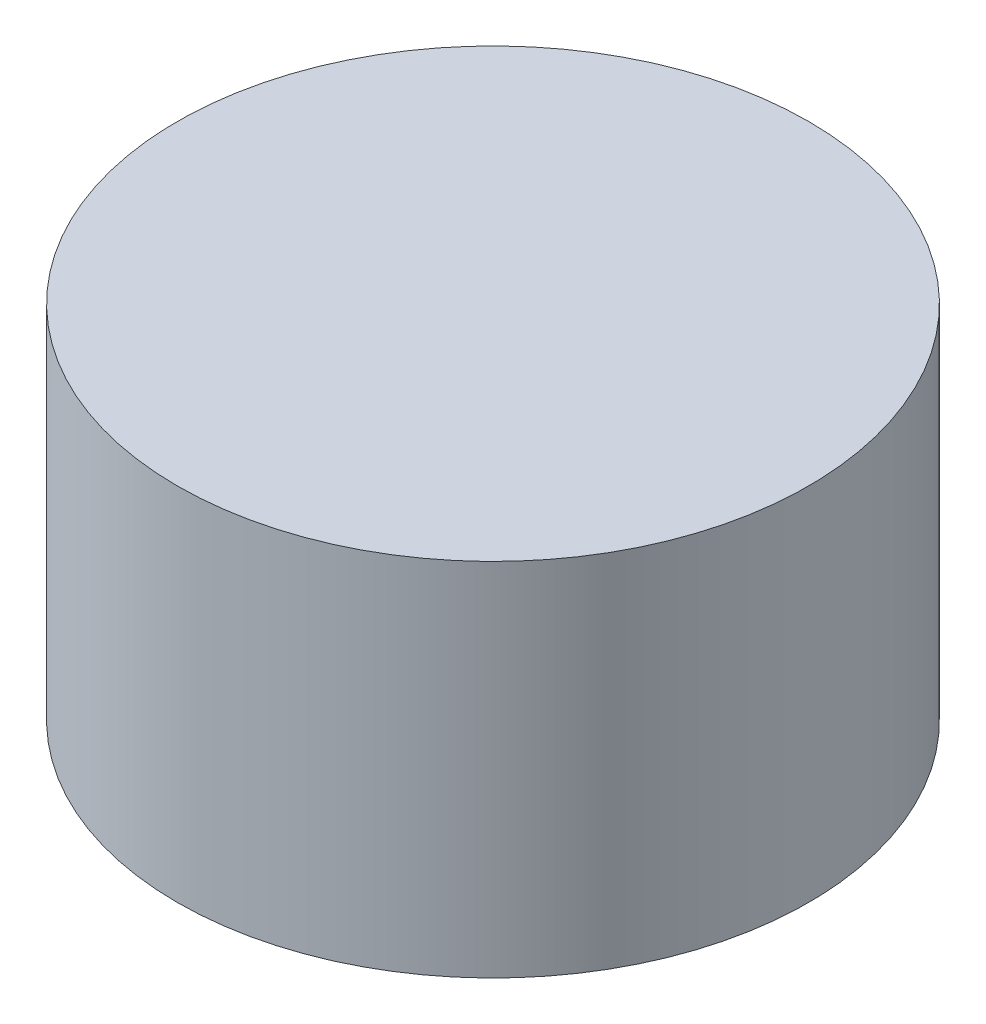
ISO-10303-21;
HEADER;
FILE_DESCRIPTION(('STEP AP214'),'2;1');
FILE_NAME('part.step','',(''),(''),'','','');
FILE_SCHEMA(('AUTOMOTIVE_DESIGN { 1 0 10303 214 1 1 1 1 }'));
ENDSEC;
DATA;
#1=APPLICATION_CONTEXT('core data for automotive mechanical design processes');
#2=APPLICATION_PROTOCOL_DEFINITION('international standard','automotive_design',2000,#1);
#3=PRODUCT_CONTEXT('',#1,'mechanical');
#4=PRODUCT('Part','Part','',(#3));
#5=PRODUCT_RELATED_PRODUCT_CATEGORY('part','',(#4));
#6=PRODUCT_DEFINITION_FORMATION('','',#4);
#7=PRODUCT_DEFINITION_CONTEXT('part definition',#1,'design');
#8=PRODUCT_DEFINITION('design','',#6,#7);
#9=PRODUCT_DEFINITION_SHAPE('','',#8);
#10=(LENGTH_UNIT() NAMED_UNIT(*) SI_UNIT(.MILLI.,.METRE.));
#11=(NAMED_UNIT(*) PLANE_ANGLE_UNIT() SI_UNIT($,.RADIAN.));
#12=(NAMED_UNIT(*) SI_UNIT($,.STERADIAN.) SOLID_ANGLE_UNIT());
#13=UNCERTAINTY_MEASURE_WITH_UNIT(LENGTH_MEASURE(1.E-05),#10,'distance_accuracy_value','');
#14=(GEOMETRIC_REPRESENTATION_CONTEXT(3) GLOBAL_UNCERTAINTY_ASSIGNED_CONTEXT((#13)) GLOBAL_UNIT_ASSIGNED_CONTEXT((#10,
#11,#12)) REPRESENTATION_CONTEXT('',''));
#15=CARTESIAN_POINT('',(0.,0.,0.));
#16=DIRECTION('',(0.,0.,1.));
#17=DIRECTION('',(1.,0.,0.));
#18=AXIS2_PLACEMENT_3D('',#15,#16,#17);
#19=CARTESIAN_POINT('',(0.,24.,0.));
#20=DIRECTION('',(0.,-1.,0.));
#21=DIRECTION('',(0.,0.,-1.));
#22=AXIS2_PLACEMENT_3D('',#19,#20,#21);
#23=CYLINDRICAL_SURFACE('',#22,21.);
#24=CARTESIAN_POINT('',(0.,24.,0.));
#25=DIRECTION('',(0.,1.,0.));
#26=DIRECTION('',(0.,0.,1.));
#27=AXIS2_PLACEMENT_3D('',#24,#25,#26);
#28=CIRCLE('',#27,21.);
#29=CARTESIAN_POINT('',(0.,24.,21.));
#30=VERTEX_POINT('',#29);
#31=EDGE_CURVE('E10',#30,#30,#28,.T.);
#32=ORIENTED_EDGE('',*,*,#31,.F.);
#33=EDGE_LOOP('',(#32));
#34=FACE_BOUND('',#33,.T.);
#35=CARTESIAN_POINT('',(0.,0.,0.));
#36=DIRECTION('',(0.,1.,0.));
#37=DIRECTION('',(0.,0.,1.));
#38=AXIS2_PLACEMENT_3D('',#35,#36,#37);
#39=CIRCLE('',#38,21.);
#40=CARTESIAN_POINT('',(0.,0.,21.));
#41=VERTEX_POINT('',#40);
#42=EDGE_CURVE('E34',#41,#41,#39,.T.);
#43=ORIENTED_EDGE('',*,*,#42,.T.);
#44=EDGE_LOOP('',(#43));
#45=FACE_BOUND('',#44,.T.);
#46=ADVANCED_FACE('F31',(#34,#45),#23,.T.);
#47=CARTESIAN_POINT('',(0.,24.,0.));
#48=DIRECTION('',(0.,1.,0.));
#49=DIRECTION('',(0.,0.,1.));
#50=AXIS2_PLACEMENT_3D('',#47,#48,#49);
#51=PLANE('',#50);
#52=ORIENTED_EDGE('',*,*,#31,.T.);
#53=EDGE_LOOP('',(#52));
#54=FACE_BOUND('',#53,.T.);
#55=ADVANCED_FACE('F46',(#54),#51,.T.);
#56=CARTESIAN_POINT('',(0.,0.,0.));
#57=DIRECTION('',(0.,1.,0.));
#58=DIRECTION('',(0.,0.,1.));
#59=AXIS2_PLACEMENT_3D('',#56,#57,#58);
#60=PLANE('',#59);
#61=ORIENTED_EDGE('',*,*,#42,.F.);
#62=EDGE_LOOP('',(#61));
#63=FACE_BOUND('',#62,.T.);
#64=ADVANCED_FACE('F44',(#63),#60,.F.);
#65=CLOSED_SHELL('',(#46,#55,#64));
#66=MANIFOLD_SOLID_BREP('B2',#65);
#67=ADVANCED_BREP_SHAPE_REPRESENTATION('',(#18,#66),#14);
#68=SHAPE_DEFINITION_REPRESENTATION(#9,#67);
ENDSEC;
END-ISO-10303-21;
